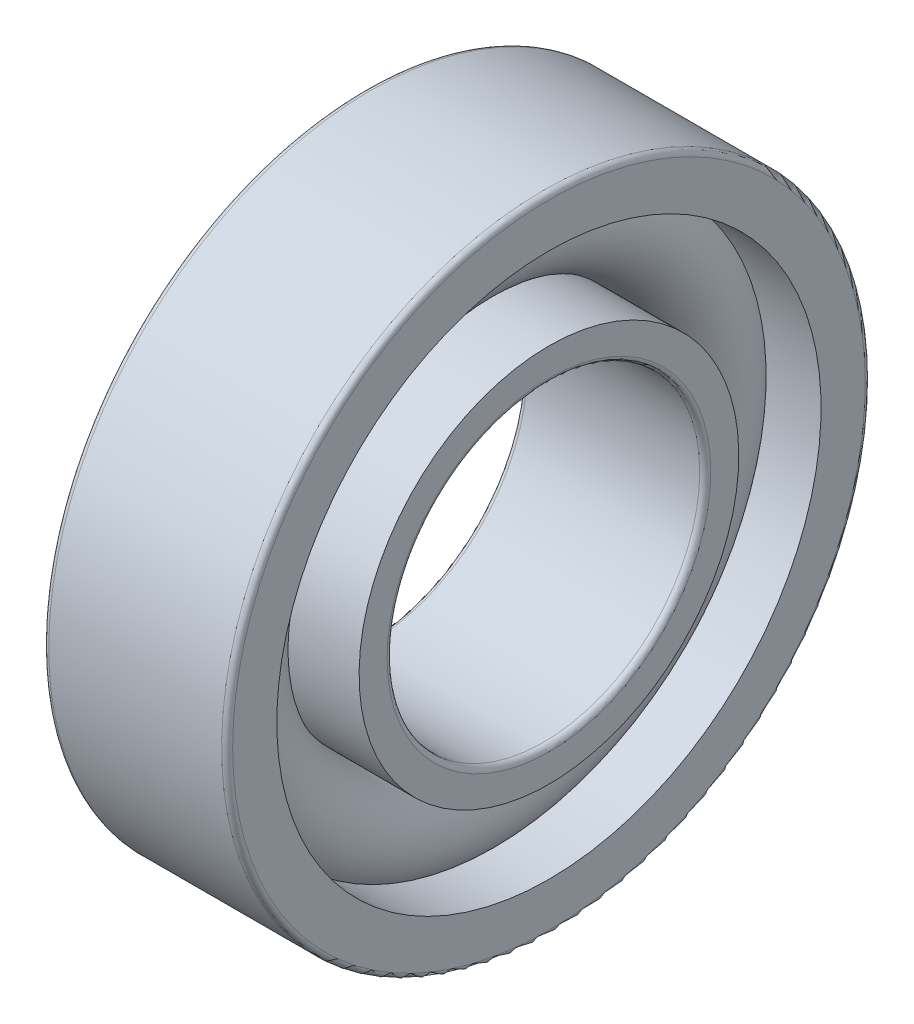
ISO-10303-21;
HEADER;
FILE_DESCRIPTION(('STEP AP214'),'2;1');
FILE_NAME('part.step','',(''),(''),'','','');
FILE_SCHEMA(('AUTOMOTIVE_DESIGN { 1 0 10303 214 1 1 1 1 }'));
ENDSEC;
DATA;
#1=APPLICATION_CONTEXT('core data for automotive mechanical design processes');
#2=APPLICATION_PROTOCOL_DEFINITION('international standard','automotive_design',2000,#1);
#3=PRODUCT_CONTEXT('',#1,'mechanical');
#4=PRODUCT('Part','Part','',(#3));
#5=PRODUCT_RELATED_PRODUCT_CATEGORY('part','',(#4));
#6=PRODUCT_DEFINITION_FORMATION('','',#4);
#7=PRODUCT_DEFINITION_CONTEXT('part definition',#1,'design');
#8=PRODUCT_DEFINITION('design','',#6,#7);
#9=PRODUCT_DEFINITION_SHAPE('','',#8);
#10=(LENGTH_UNIT() NAMED_UNIT(*) SI_UNIT(.MILLI.,.METRE.));
#11=(NAMED_UNIT(*) PLANE_ANGLE_UNIT() SI_UNIT($,.RADIAN.));
#12=(NAMED_UNIT(*) SI_UNIT($,.STERADIAN.) SOLID_ANGLE_UNIT());
#13=UNCERTAINTY_MEASURE_WITH_UNIT(LENGTH_MEASURE(1.E-05),#10,'distance_accuracy_value','');
#14=(GEOMETRIC_REPRESENTATION_CONTEXT(3) GLOBAL_UNCERTAINTY_ASSIGNED_CONTEXT((#13)) GLOBAL_UNIT_ASSIGNED_CONTEXT((#10,
#11,#12)) REPRESENTATION_CONTEXT('',''));
#15=CARTESIAN_POINT('',(0.,0.,0.));
#16=DIRECTION('',(0.,0.,1.));
#17=DIRECTION('',(1.,0.,0.));
#18=AXIS2_PLACEMENT_3D('',#15,#16,#17);
#19=CARTESIAN_POINT('',(-20.6375,0.,0.));
#20=DIRECTION('',(1.,0.,0.));
#21=DIRECTION('',(0.,1.,0.));
#22=AXIS2_PLACEMENT_3D('',#19,#20,#21);
#23=CYLINDRICAL_SURFACE('',#22,8.5);
#24=CARTESIAN_POINT('',(4.69999999999993,4.44089209850063E-13,0.));
#25=DIRECTION('',(1.,0.,0.));
#26=DIRECTION('',(0.,0.,-1.));
#27=AXIS2_PLACEMENT_3D('',#24,#25,#26);
#28=CIRCLE('',#27,8.5);
#29=CARTESIAN_POINT('',(4.69999999999993,4.40668335155436E-13,-8.5));
#30=VERTEX_POINT('',#29);
#31=EDGE_CURVE('E67',#30,#30,#28,.F.);
#32=ORIENTED_EDGE('',*,*,#31,.F.);
#33=EDGE_LOOP('',(#32));
#34=FACE_BOUND('',#33,.T.);
#35=CARTESIAN_POINT('',(-4.6999999999997,3.33066907387547E-13,0.));
#36=DIRECTION('',(1.,0.,0.));
#37=DIRECTION('',(0.,0.,-1.));
#38=AXIS2_PLACEMENT_3D('',#35,#36,#37);
#39=CIRCLE('',#38,8.5);
#40=CARTESIAN_POINT('',(-4.6999999999997,3.29646032692921E-13,-8.5));
#41=VERTEX_POINT('',#40);
#42=EDGE_CURVE('E130',#41,#41,#39,.T.);
#43=ORIENTED_EDGE('',*,*,#42,.F.);
#44=EDGE_LOOP('',(#43));
#45=FACE_BOUND('',#44,.T.);
#46=ADVANCED_FACE('F16',(#34,#45),#23,.F.);
#47=CARTESIAN_POINT('',(-4.6999999999997,3.33066907387547E-13,0.));
#48=DIRECTION('',(1.,0.,0.));
#49=DIRECTION('',(0.,0.,-1.));
#50=AXIS2_PLACEMENT_3D('',#47,#48,#49);
#51=TOROIDAL_SURFACE('',#50,8.8,0.3);
#52=ORIENTED_EDGE('',*,*,#42,.T.);
#53=EDGE_LOOP('',(#52));
#54=FACE_BOUND('',#53,.T.);
#55=CARTESIAN_POINT('',(-4.99999999999971,3.33046090705835E-13,0.));
#56=DIRECTION('',(-1.,0.,0.));
#57=DIRECTION('',(0.,0.,-1.));
#58=AXIS2_PLACEMENT_3D('',#55,#56,#57);
#59=CIRCLE('',#58,8.8);
#60=CARTESIAN_POINT('',(-4.99999999999974,2.70690323125869E-13,8.8));
#61=VERTEX_POINT('',#60);
#62=CARTESIAN_POINT('',(-4.99999999999974,3.29541671728606E-13,-8.8));
#63=VERTEX_POINT('',#62);
#64=EDGE_CURVE('E57',#61,#63,#59,.F.);
#65=ORIENTED_EDGE('',*,*,#64,.F.);
#66=CARTESIAN_POINT('',(-4.99999999999971,3.33046090705835E-13,0.));
#67=DIRECTION('',(-1.,0.,0.));
#68=DIRECTION('',(0.,0.,1.));
#69=AXIS2_PLACEMENT_3D('',#66,#67,#68);
#70=CIRCLE('',#69,8.8);
#71=EDGE_CURVE('E55',#63,#61,#70,.F.);
#72=ORIENTED_EDGE('',*,*,#71,.F.);
#73=EDGE_LOOP('',(#65,#72));
#74=FACE_BOUND('',#73,.T.);
#75=ADVANCED_FACE('F59',(#54,#74),#51,.T.);
#76=CARTESIAN_POINT('',(4.69999999999993,4.44089209850063E-13,0.));
#77=DIRECTION('',(1.,0.,0.));
#78=DIRECTION('',(0.,0.,-1.));
#79=AXIS2_PLACEMENT_3D('',#76,#77,#78);
#80=TOROIDAL_SURFACE('',#79,8.8,0.3);
#81=CARTESIAN_POINT('',(4.99999999999993,4.44110026531774E-13,0.));
#82=DIRECTION('',(1.,0.,0.));
#83=DIRECTION('',(0.,0.,-1.));
#84=AXIS2_PLACEMENT_3D('',#81,#82,#83);
#85=CIRCLE('',#84,8.80000000000003);
#86=CARTESIAN_POINT('',(5.,4.48954948409344E-13,8.79999999999997));
#87=VERTEX_POINT('',#86);
#88=CARTESIAN_POINT('',(5.,4.40588954209176E-13,-8.80000000000002));
#89=VERTEX_POINT('',#88);
#90=EDGE_CURVE('E62',#87,#89,#85,.F.);
#91=ORIENTED_EDGE('',*,*,#90,.F.);
#92=CARTESIAN_POINT('',(4.99999999999993,4.44110026531774E-13,0.));
#93=DIRECTION('',(1.,0.,0.));
#94=DIRECTION('',(0.,0.,1.));
#95=AXIS2_PLACEMENT_3D('',#92,#93,#94);
#96=CIRCLE('',#95,8.79999999999997);
#97=EDGE_CURVE('E106',#89,#87,#96,.F.);
#98=ORIENTED_EDGE('',*,*,#97,.F.);
#99=EDGE_LOOP('',(#91,#98));
#100=FACE_BOUND('',#99,.T.);
#101=ORIENTED_EDGE('',*,*,#31,.T.);
#102=EDGE_LOOP('',(#101));
#103=FACE_BOUND('',#102,.T.);
#104=ADVANCED_FACE('F87',(#100,#103),#80,.T.);
#105=CARTESIAN_POINT('',(-4.99999999999978,11.2000000000002,0.));
#106=DIRECTION('',(-1.,0.,0.));
#107=DIRECTION('',(0.,-1.,0.));
#108=AXIS2_PLACEMENT_3D('',#105,#106,#107);
#109=PLANE('',#108);
#110=CARTESIAN_POINT('',(-4.99999999999978,0.,0.));
#111=DIRECTION('',(1.,0.,0.));
#112=DIRECTION('',(0.,1.,0.));
#113=AXIS2_PLACEMENT_3D('',#110,#111,#112);
#114=CIRCLE('',#113,11.2);
#115=CARTESIAN_POINT('',(-4.99999999999978,11.2,0.));
#116=VERTEX_POINT('',#115);
#117=EDGE_CURVE('E146',#116,#116,#114,.T.);
#118=ORIENTED_EDGE('',*,*,#117,.F.);
#119=EDGE_LOOP('',(#118));
#120=FACE_BOUND('',#119,.T.);
#121=ORIENTED_EDGE('',*,*,#71,.T.);
#122=ORIENTED_EDGE('',*,*,#64,.T.);
#123=EDGE_LOOP('',(#121,#122));
#124=FACE_BOUND('',#123,.T.);
#125=ADVANCED_FACE('F66',(#120,#124),#109,.T.);
#126=CARTESIAN_POINT('',(5.00000000000012,8.80000000000009,-1.11022302462516E-13));
#127=DIRECTION('',(1.,0.,0.));
#128=DIRECTION('',(0.,1.,0.));
#129=AXIS2_PLACEMENT_3D('',#126,#127,#128);
#130=PLANE('',#129);
#131=ORIENTED_EDGE('',*,*,#90,.T.);
#132=ORIENTED_EDGE('',*,*,#97,.T.);
#133=EDGE_LOOP('',(#131,#132));
#134=FACE_BOUND('',#133,.T.);
#135=CARTESIAN_POINT('',(4.99999999999984,0.,0.));
#136=DIRECTION('',(1.,0.,0.));
#137=DIRECTION('',(0.,1.,0.));
#138=AXIS2_PLACEMENT_3D('',#135,#136,#137);
#139=CIRCLE('',#138,10.325);
#140=CARTESIAN_POINT('',(4.99999999999984,10.325,0.));
#141=VERTEX_POINT('',#140);
#142=EDGE_CURVE('E142',#141,#141,#139,.F.);
#143=ORIENTED_EDGE('',*,*,#142,.F.);
#144=EDGE_LOOP('',(#143));
#145=FACE_BOUND('',#144,.T.);
#146=ADVANCED_FACE('F86',(#134,#145),#130,.T.);
#147=CARTESIAN_POINT('',(-20.6375,0.,0.));
#148=DIRECTION('',(1.,0.,0.));
#149=DIRECTION('',(0.,1.,0.));
#150=AXIS2_PLACEMENT_3D('',#147,#148,#149);
#151=CYLINDRICAL_SURFACE('',#150,11.2);
#152=ORIENTED_EDGE('',*,*,#117,.T.);
#153=EDGE_LOOP('',(#152));
#154=FACE_BOUND('',#153,.T.);
#155=CARTESIAN_POINT('',(-2.01246117974978,0.,0.));
#156=DIRECTION('',(-1.,0.,0.));
#157=DIRECTION('',(0.,0.,1.));
#158=AXIS2_PLACEMENT_3D('',#155,#156,#157);
#159=CIRCLE('',#158,11.2);
#160=CARTESIAN_POINT('',(-2.01246117974978,0.,11.2));
#161=VERTEX_POINT('',#160);
#162=EDGE_CURVE('E145',#161,#161,#159,.F.);
#163=ORIENTED_EDGE('',*,*,#162,.F.);
#164=EDGE_LOOP('',(#163));
#165=FACE_BOUND('',#164,.T.);
#166=ADVANCED_FACE('F279',(#154,#165),#151,.T.);
#167=CARTESIAN_POINT('',(-20.6375,0.,0.));
#168=DIRECTION('',(1.,0.,0.));
#169=DIRECTION('',(0.,1.,0.));
#170=AXIS2_PLACEMENT_3D('',#167,#168,#169);
#171=CYLINDRICAL_SURFACE('',#170,10.325);
#172=CARTESIAN_POINT('',(0.366571957465585,0.,0.));
#173=DIRECTION('',(-1.,0.,0.));
#174=DIRECTION('',(0.,0.,1.));
#175=AXIS2_PLACEMENT_3D('',#172,#173,#174);
#176=CIRCLE('',#175,10.325);
#177=CARTESIAN_POINT('',(0.366571957465584,0.,10.325));
#178=VERTEX_POINT('',#177);
#179=EDGE_CURVE('E263',#178,#178,#176,.T.);
#180=ORIENTED_EDGE('',*,*,#179,.F.);
#181=EDGE_LOOP('',(#180));
#182=FACE_BOUND('',#181,.T.);
#183=ORIENTED_EDGE('',*,*,#142,.T.);
#184=EDGE_LOOP('',(#183));
#185=FACE_BOUND('',#184,.T.);
#186=ADVANCED_FACE('F258',(#182,#185),#171,.T.);
#187=CARTESIAN_POINT('',(0.,0.,0.));
#188=DIRECTION('',(-1.,0.,0.));
#189=DIRECTION('',(0.,0.,1.));
#190=AXIS2_PLACEMENT_3D('',#187,#188,#189);
#191=TOROIDAL_SURFACE('',#190,13.,2.7);
#192=CARTESIAN_POINT('',(-0.366571957465367,0.,0.));
#193=DIRECTION('',(1.,0.,0.));
#194=DIRECTION('',(0.,1.,0.));
#195=AXIS2_PLACEMENT_3D('',#192,#193,#194);
#196=CIRCLE('',#195,15.675);
#197=CARTESIAN_POINT('',(-0.366571957465368,15.675,0.));
#198=VERTEX_POINT('',#197);
#199=EDGE_CURVE('E262',#198,#198,#196,.F.);
#200=ORIENTED_EDGE('',*,*,#199,.T.);
#201=EDGE_LOOP('',(#200));
#202=FACE_BOUND('',#201,.T.);
#203=ORIENTED_EDGE('',*,*,#162,.T.);
#204=EDGE_LOOP('',(#203));
#205=FACE_BOUND('',#204,.T.);
#206=ADVANCED_FACE('F253',(#202,#205),#191,.T.);
#207=CARTESIAN_POINT('',(0.,0.,0.));
#208=DIRECTION('',(-1.,0.,0.));
#209=DIRECTION('',(0.,0.,1.));
#210=AXIS2_PLACEMENT_3D('',#207,#208,#209);
#211=TOROIDAL_SURFACE('',#210,13.,2.7);
#212=ORIENTED_EDGE('',*,*,#179,.T.);
#213=EDGE_LOOP('',(#212));
#214=FACE_BOUND('',#213,.T.);
#215=CARTESIAN_POINT('',(2.01246117974979,0.,0.));
#216=DIRECTION('',(1.,0.,0.));
#217=DIRECTION('',(0.,1.,0.));
#218=AXIS2_PLACEMENT_3D('',#215,#216,#217);
#219=CIRCLE('',#218,14.8);
#220=CARTESIAN_POINT('',(2.01246117974979,14.8,0.));
#221=VERTEX_POINT('',#220);
#222=EDGE_CURVE('E141',#221,#221,#219,.T.);
#223=ORIENTED_EDGE('',*,*,#222,.T.);
#224=EDGE_LOOP('',(#223));
#225=FACE_BOUND('',#224,.T.);
#226=ADVANCED_FACE('F249',(#214,#225),#211,.T.);
#227=CARTESIAN_POINT('',(-20.6375,0.,0.));
#228=DIRECTION('',(1.,0.,0.));
#229=DIRECTION('',(0.,1.,0.));
#230=AXIS2_PLACEMENT_3D('',#227,#228,#229);
#231=CYLINDRICAL_SURFACE('',#230,15.675);
#232=ORIENTED_EDGE('',*,*,#199,.F.);
#233=EDGE_LOOP('',(#232));
#234=FACE_BOUND('',#233,.T.);
#235=CARTESIAN_POINT('',(-4.99999999999978,0.,0.));
#236=DIRECTION('',(1.,0.,0.));
#237=DIRECTION('',(0.,1.,0.));
#238=AXIS2_PLACEMENT_3D('',#235,#236,#237);
#239=CIRCLE('',#238,15.675);
#240=CARTESIAN_POINT('',(-4.99999999999978,15.675,0.));
#241=VERTEX_POINT('',#240);
#242=EDGE_CURVE('E137',#241,#241,#239,.T.);
#243=ORIENTED_EDGE('',*,*,#242,.F.);
#244=EDGE_LOOP('',(#243));
#245=FACE_BOUND('',#244,.T.);
#246=ADVANCED_FACE('F252',(#234,#245),#231,.F.);
#247=CARTESIAN_POINT('',(-20.6375,0.,0.));
#248=DIRECTION('',(1.,0.,0.));
#249=DIRECTION('',(0.,1.,0.));
#250=AXIS2_PLACEMENT_3D('',#247,#248,#249);
#251=CYLINDRICAL_SURFACE('',#250,14.8);
#252=CARTESIAN_POINT('',(4.99999999999984,0.,0.));
#253=DIRECTION('',(1.,0.,0.));
#254=DIRECTION('',(0.,1.,0.));
#255=AXIS2_PLACEMENT_3D('',#252,#253,#254);
#256=CIRCLE('',#255,14.8);
#257=CARTESIAN_POINT('',(4.99999999999984,14.8,0.));
#258=VERTEX_POINT('',#257);
#259=EDGE_CURVE('E133',#258,#258,#256,.F.);
#260=ORIENTED_EDGE('',*,*,#259,.F.);
#261=EDGE_LOOP('',(#260));
#262=FACE_BOUND('',#261,.T.);
#263=ORIENTED_EDGE('',*,*,#222,.F.);
#264=EDGE_LOOP('',(#263));
#265=FACE_BOUND('',#264,.T.);
#266=ADVANCED_FACE('F224',(#262,#265),#251,.F.);
#267=CARTESIAN_POINT('',(-4.99999999999989,15.675,0.));
#268=DIRECTION('',(-1.,0.,0.));
#269=DIRECTION('',(0.,-1.,0.));
#270=AXIS2_PLACEMENT_3D('',#267,#268,#269);
#271=PLANE('',#270);
#272=CARTESIAN_POINT('',(-4.99999999999971,3.33046090705835E-13,0.));
#273=DIRECTION('',(1.,0.,0.));
#274=DIRECTION('',(0.,0.,-1.));
#275=AXIS2_PLACEMENT_3D('',#272,#273,#274);
#276=CIRCLE('',#275,17.2);
#277=CARTESIAN_POINT('',(-4.99999999999978,3.26125515481834E-13,-17.2));
#278=VERTEX_POINT('',#277);
#279=CARTESIAN_POINT('',(-4.99999999999978,3.42634933552707E-13,17.2));
#280=VERTEX_POINT('',#279);
#281=EDGE_CURVE('E140',#278,#280,#276,.T.);
#282=ORIENTED_EDGE('',*,*,#281,.F.);
#283=CARTESIAN_POINT('',(-4.99999999999971,3.33046090705835E-13,0.));
#284=DIRECTION('',(1.,0.,0.));
#285=DIRECTION('',(0.,0.,1.));
#286=AXIS2_PLACEMENT_3D('',#283,#284,#285);
#287=CIRCLE('',#286,17.2);
#288=EDGE_CURVE('E136',#280,#278,#287,.T.);
#289=ORIENTED_EDGE('',*,*,#288,.F.);
#290=EDGE_LOOP('',(#282,#289));
#291=FACE_BOUND('',#290,.T.);
#292=ORIENTED_EDGE('',*,*,#242,.T.);
#293=EDGE_LOOP('',(#292));
#294=FACE_BOUND('',#293,.T.);
#295=ADVANCED_FACE('F215',(#291,#294),#271,.T.);
#296=CARTESIAN_POINT('',(5.00000000000014,17.2000000000005,-1.11022302462516E-13));
#297=DIRECTION('',(1.,0.,0.));
#298=DIRECTION('',(0.,1.,0.));
#299=AXIS2_PLACEMENT_3D('',#296,#297,#298);
#300=PLANE('',#299);
#301=ORIENTED_EDGE('',*,*,#259,.T.);
#302=EDGE_LOOP('',(#301));
#303=FACE_BOUND('',#302,.T.);
#304=CARTESIAN_POINT('',(4.99999999999993,4.44110026531774E-13,0.));
#305=DIRECTION('',(-1.,0.,0.));
#306=DIRECTION('',(0.,0.,1.));
#307=AXIS2_PLACEMENT_3D('',#304,#305,#306);
#308=CIRCLE('',#307,17.1999999999999);
#309=CARTESIAN_POINT('',(5.00000000000001,3.03946035007385E-13,-17.2));
#310=VERTEX_POINT('',#309);
#311=CARTESIAN_POINT('',(5.00000000000001,2.84111192144129E-13,17.1999999999999));
#312=VERTEX_POINT('',#311);
#313=EDGE_CURVE('E34',#310,#312,#308,.F.);
#314=ORIENTED_EDGE('',*,*,#313,.T.);
#315=CARTESIAN_POINT('',(4.99999999999993,4.44110026531774E-13,0.));
#316=DIRECTION('',(-1.,0.,0.));
#317=DIRECTION('',(0.,0.,-1.));
#318=AXIS2_PLACEMENT_3D('',#315,#316,#317);
#319=CIRCLE('',#318,17.2000000000001);
#320=EDGE_CURVE('E191',#310,#312,#319,.T.);
#321=ORIENTED_EDGE('',*,*,#320,.F.);
#322=EDGE_LOOP('',(#314,#321));
#323=FACE_BOUND('',#322,.T.);
#324=ADVANCED_FACE('F169',(#303,#323),#300,.T.);
#325=CARTESIAN_POINT('',(-4.6999999999997,3.33066907387547E-13,0.));
#326=DIRECTION('',(1.,0.,0.));
#327=DIRECTION('',(0.,0.,-1.));
#328=AXIS2_PLACEMENT_3D('',#325,#326,#327);
#329=TOROIDAL_SURFACE('',#328,17.2,0.300000000000001);
#330=ORIENTED_EDGE('',*,*,#281,.T.);
#331=ORIENTED_EDGE('',*,*,#288,.T.);
#332=EDGE_LOOP('',(#330,#331));
#333=FACE_BOUND('',#332,.T.);
#334=CARTESIAN_POINT('',(-4.6999999999997,0.,0.));
#335=DIRECTION('',(1.,0.,0.));
#336=DIRECTION('',(0.,1.,0.));
#337=AXIS2_PLACEMENT_3D('',#334,#335,#336);
#338=CIRCLE('',#337,17.5);
#339=CARTESIAN_POINT('',(-4.69999999999971,17.5,0.));
#340=VERTEX_POINT('',#339);
#341=EDGE_CURVE('E26',#340,#340,#338,.T.);
#342=ORIENTED_EDGE('',*,*,#341,.F.);
#343=EDGE_LOOP('',(#342));
#344=FACE_BOUND('',#343,.T.);
#345=ADVANCED_FACE('F157',(#333,#344),#329,.T.);
#346=CARTESIAN_POINT('',(4.69999999999993,4.44089209850063E-13,0.));
#347=DIRECTION('',(1.,0.,0.));
#348=DIRECTION('',(0.,0.,-1.));
#349=AXIS2_PLACEMENT_3D('',#346,#347,#348);
#350=TOROIDAL_SURFACE('',#349,17.2,0.300000000000001);
#351=ORIENTED_EDGE('',*,*,#320,.T.);
#352=ORIENTED_EDGE('',*,*,#313,.F.);
#353=EDGE_LOOP('',(#351,#352));
#354=FACE_BOUND('',#353,.T.);
#355=CARTESIAN_POINT('',(4.69999999999993,0.,0.));
#356=DIRECTION('',(1.,0.,0.));
#357=DIRECTION('',(0.,1.,0.));
#358=AXIS2_PLACEMENT_3D('',#355,#356,#357);
#359=CIRCLE('',#358,17.5);
#360=CARTESIAN_POINT('',(4.69999999999993,17.5,0.));
#361=VERTEX_POINT('',#360);
#362=EDGE_CURVE('E11',#361,#361,#359,.F.);
#363=ORIENTED_EDGE('',*,*,#362,.F.);
#364=EDGE_LOOP('',(#363));
#365=FACE_BOUND('',#364,.T.);
#366=ADVANCED_FACE('F168',(#354,#365),#350,.T.);
#367=CARTESIAN_POINT('',(-20.6375,0.,0.));
#368=DIRECTION('',(1.,0.,0.));
#369=DIRECTION('',(0.,1.,0.));
#370=AXIS2_PLACEMENT_3D('',#367,#368,#369);
#371=CYLINDRICAL_SURFACE('',#370,17.5);
#372=ORIENTED_EDGE('',*,*,#341,.T.);
#373=EDGE_LOOP('',(#372));
#374=FACE_BOUND('',#373,.T.);
#375=ORIENTED_EDGE('',*,*,#362,.T.);
#376=EDGE_LOOP('',(#375));
#377=FACE_BOUND('',#376,.T.);
#378=ADVANCED_FACE('F290',(#374,#377),#371,.T.);
#379=CLOSED_SHELL('',(#46,#75,#104,#125,#146,#166,#186,#206,#226,#246,#266,#295,#324,#345,#366,#378));
#380=MANIFOLD_SOLID_BREP('B1',#379);
#381=ADVANCED_BREP_SHAPE_REPRESENTATION('',(#18,#380),#14);
#382=SHAPE_DEFINITION_REPRESENTATION(#9,#381);
ENDSEC;
END-ISO-10303-21;
